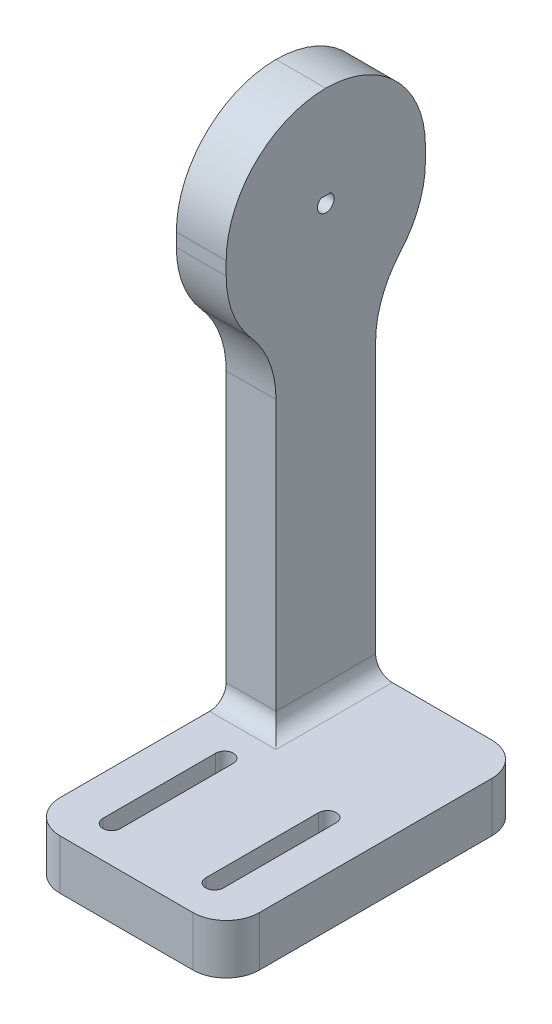
ISO-10303-21;
HEADER;
FILE_DESCRIPTION(('STEP AP214'),'2;1');
FILE_NAME('part.step','',(''),(''),'','','');
FILE_SCHEMA(('AUTOMOTIVE_DESIGN { 1 0 10303 214 1 1 1 1 }'));
ENDSEC;
DATA;
#1=APPLICATION_CONTEXT('core data for automotive mechanical design processes');
#2=APPLICATION_PROTOCOL_DEFINITION('international standard','automotive_design',2000,#1);
#3=PRODUCT_CONTEXT('',#1,'mechanical');
#4=PRODUCT('Part','Part','',(#3));
#5=PRODUCT_RELATED_PRODUCT_CATEGORY('part','',(#4));
#6=PRODUCT_DEFINITION_FORMATION('','',#4);
#7=PRODUCT_DEFINITION_CONTEXT('part definition',#1,'design');
#8=PRODUCT_DEFINITION('design','',#6,#7);
#9=PRODUCT_DEFINITION_SHAPE('','',#8);
#10=(LENGTH_UNIT() NAMED_UNIT(*) SI_UNIT(.MILLI.,.METRE.));
#11=(NAMED_UNIT(*) PLANE_ANGLE_UNIT() SI_UNIT($,.RADIAN.));
#12=(NAMED_UNIT(*) SI_UNIT($,.STERADIAN.) SOLID_ANGLE_UNIT());
#13=UNCERTAINTY_MEASURE_WITH_UNIT(LENGTH_MEASURE(1.E-05),#10,'distance_accuracy_value','');
#14=(GEOMETRIC_REPRESENTATION_CONTEXT(3) GLOBAL_UNCERTAINTY_ASSIGNED_CONTEXT((#13)) GLOBAL_UNIT_ASSIGNED_CONTEXT((#10,
#11,#12)) REPRESENTATION_CONTEXT('',''));
#15=CARTESIAN_POINT('',(0.,0.,0.));
#16=DIRECTION('',(0.,0.,1.));
#17=DIRECTION('',(1.,0.,0.));
#18=AXIS2_PLACEMENT_3D('',#15,#16,#17);
#19=CARTESIAN_POINT('',(15.,-30.,30.));
#20=DIRECTION('',(0.,0.,-1.));
#21=DIRECTION('',(-1.,0.,0.));
#22=AXIS2_PLACEMENT_3D('',#19,#20,#21);
#23=PLANE('',#22);
#24=DIRECTION('',(0.,-1.,0.));
#25=VECTOR('',#24,1.);
#26=CARTESIAN_POINT('',(15.,-30.,30.));
#27=LINE('',#26,#25);
#28=CARTESIAN_POINT('',(15.,0.,30.));
#29=VERTEX_POINT('',#28);
#30=CARTESIAN_POINT('',(15.,-4.01923788646685,30.));
#31=VERTEX_POINT('',#30);
#32=EDGE_CURVE('E335',#29,#31,#27,.T.);
#33=ORIENTED_EDGE('',*,*,#32,.F.);
#34=DIRECTION('',(-1.,0.,0.));
#35=VECTOR('',#34,1.);
#36=CARTESIAN_POINT('',(15.,0.,30.));
#37=LINE('',#36,#35);
#38=CARTESIAN_POINT('',(0.,0.,30.));
#39=VERTEX_POINT('',#38);
#40=EDGE_CURVE('E348',#29,#39,#37,.T.);
#41=ORIENTED_EDGE('',*,*,#40,.T.);
#42=DIRECTION('',(0.,-1.,0.));
#43=VECTOR('',#42,1.);
#44=CARTESIAN_POINT('',(0.,-30.,30.));
#45=LINE('',#44,#43);
#46=CARTESIAN_POINT('',(0.,-4.01923788646685,30.));
#47=VERTEX_POINT('',#46);
#48=EDGE_CURVE('E334',#39,#47,#45,.T.);
#49=ORIENTED_EDGE('',*,*,#48,.T.);
#50=DIRECTION('',(-1.,0.,0.));
#51=VECTOR('',#50,1.);
#52=CARTESIAN_POINT('',(15.,-4.01923788646685,30.));
#53=LINE('',#52,#51);
#54=EDGE_CURVE('E342',#47,#31,#53,.F.);
#55=ORIENTED_EDGE('',*,*,#54,.T.);
#56=EDGE_LOOP('',(#33,#41,#49,#55));
#57=FACE_BOUND('',#56,.T.);
#58=ADVANCED_FACE('F33',(#57),#23,.F.);
#59=CARTESIAN_POINT('',(15.,-30.,-30.));
#60=DIRECTION('',(0.,0.,1.));
#61=DIRECTION('',(0.,-1.,0.));
#62=AXIS2_PLACEMENT_3D('',#59,#60,#61);
#63=PLANE('',#62);
#64=DIRECTION('',(0.,1.,0.));
#65=VECTOR('',#64,1.);
#66=CARTESIAN_POINT('',(15.,-30.,-30.));
#67=LINE('',#66,#65);
#68=CARTESIAN_POINT('',(15.,-4.01923788646684,-30.));
#69=VERTEX_POINT('',#68);
#70=CARTESIAN_POINT('',(15.,0.,-30.));
#71=VERTEX_POINT('',#70);
#72=EDGE_CURVE('E338',#69,#71,#67,.T.);
#73=ORIENTED_EDGE('',*,*,#72,.F.);
#74=DIRECTION('',(1.,0.,0.));
#75=VECTOR('',#74,1.);
#76=CARTESIAN_POINT('',(15.,-4.01923788646684,-30.));
#77=LINE('',#76,#75);
#78=CARTESIAN_POINT('',(0.,-4.01923788646684,-30.));
#79=VERTEX_POINT('',#78);
#80=EDGE_CURVE('E370',#69,#79,#77,.F.);
#81=ORIENTED_EDGE('',*,*,#80,.T.);
#82=DIRECTION('',(0.,1.,0.));
#83=VECTOR('',#82,1.);
#84=CARTESIAN_POINT('',(0.,-30.,-30.));
#85=LINE('',#84,#83);
#86=CARTESIAN_POINT('',(0.,0.,-30.));
#87=VERTEX_POINT('',#86);
#88=EDGE_CURVE('E339',#79,#87,#85,.T.);
#89=ORIENTED_EDGE('',*,*,#88,.T.);
#90=DIRECTION('',(-1.,0.,0.));
#91=VECTOR('',#90,1.);
#92=CARTESIAN_POINT('',(15.,0.,-30.));
#93=LINE('',#92,#91);
#94=EDGE_CURVE('E368',#87,#71,#93,.F.);
#95=ORIENTED_EDGE('',*,*,#94,.T.);
#96=EDGE_LOOP('',(#73,#81,#89,#95));
#97=FACE_BOUND('',#96,.T.);
#98=ADVANCED_FACE('F467',(#97),#63,.F.);
#99=CARTESIAN_POINT('',(15.,0.,0.));
#100=DIRECTION('',(1.,0.,0.));
#101=DIRECTION('',(0.,0.,-1.));
#102=AXIS2_PLACEMENT_3D('',#99,#100,#101);
#103=PLANE('',#102);
#104=DIRECTION('',(0.,0.,1.));
#105=VECTOR('',#104,1.);
#106=CARTESIAN_POINT('',(15.,2.,0.));
#107=LINE('',#106,#105);
#108=CARTESIAN_POINT('',(15.,2.,-1.5));
#109=VERTEX_POINT('',#108);
#110=CARTESIAN_POINT('',(15.,2.,1.5));
#111=VERTEX_POINT('',#110);
#112=EDGE_CURVE('E319',#109,#111,#107,.T.);
#113=ORIENTED_EDGE('',*,*,#112,.F.);
#114=CARTESIAN_POINT('',(15.,0.,0.));
#115=DIRECTION('',(1.,0.,0.));
#116=DIRECTION('',(0.,0.,-1.));
#117=AXIS2_PLACEMENT_3D('',#114,#115,#116);
#118=CIRCLE('',#117,2.5);
#119=EDGE_CURVE('E326',#111,#109,#118,.T.);
#120=ORIENTED_EDGE('',*,*,#119,.F.);
#121=EDGE_LOOP('',(#113,#120));
#122=FACE_BOUND('',#121,.T.);
#123=DIRECTION('',(0.,1.,0.));
#124=VECTOR('',#123,1.);
#125=CARTESIAN_POINT('',(15.,-130.,15.));
#126=LINE('',#125,#124);
#127=CARTESIAN_POINT('',(15.,-125.,15.));
#128=VERTEX_POINT('',#127);
#129=CARTESIAN_POINT('',(15.,-43.7055075524357,15.));
#130=VERTEX_POINT('',#129);
#131=EDGE_CURVE('E311',#128,#130,#126,.T.);
#132=ORIENTED_EDGE('',*,*,#131,.F.);
#133=DIRECTION('',(0.,0.,1.));
#134=VECTOR('',#133,1.);
#135=CARTESIAN_POINT('',(15.,-125.,-15.));
#136=LINE('',#135,#134);
#137=CARTESIAN_POINT('',(15.,-125.,-15.));
#138=VERTEX_POINT('',#137);
#139=EDGE_CURVE('E384',#128,#138,#136,.F.);
#140=ORIENTED_EDGE('',*,*,#139,.T.);
#141=DIRECTION('',(0.,1.,0.));
#142=VECTOR('',#141,1.);
#143=CARTESIAN_POINT('',(15.,-130.,-15.));
#144=LINE('',#143,#142);
#145=CARTESIAN_POINT('',(15.,-43.7055075524357,-15.));
#146=VERTEX_POINT('',#145);
#147=EDGE_CURVE('E314',#138,#146,#144,.T.);
#148=ORIENTED_EDGE('',*,*,#147,.T.);
#149=CARTESIAN_POINT('',(15.,-43.7055075524357,-45.));
#150=DIRECTION('',(1.,0.,0.));
#151=DIRECTION('',(0.,0.,-1.));
#152=AXIS2_PLACEMENT_3D('',#149,#150,#151);
#153=CIRCLE('',#152,30.);
#154=CARTESIAN_POINT('',(15.,-23.8623727194513,-22.5));
#155=VERTEX_POINT('',#154);
#156=EDGE_CURVE('E41',#146,#155,#153,.F.);
#157=ORIENTED_EDGE('',*,*,#156,.T.);
#158=CARTESIAN_POINT('',(15.,-4.01923788646684,0.));
#159=DIRECTION('',(1.,0.,0.));
#160=DIRECTION('',(0.,0.,-1.));
#161=AXIS2_PLACEMENT_3D('',#158,#159,#160);
#162=CIRCLE('',#161,30.);
#163=EDGE_CURVE('E363',#155,#69,#162,.T.);
#164=ORIENTED_EDGE('',*,*,#163,.T.);
#165=ORIENTED_EDGE('',*,*,#72,.T.);
#166=CARTESIAN_POINT('',(15.,0.,0.));
#167=DIRECTION('',(1.,0.,0.));
#168=DIRECTION('',(0.,0.,-1.));
#169=AXIS2_PLACEMENT_3D('',#166,#167,#168);
#170=CIRCLE('',#169,30.);
#171=CARTESIAN_POINT('',(15.,30.,0.));
#172=VERTEX_POINT('',#171);
#173=EDGE_CURVE('E359',#71,#172,#170,.T.);
#174=ORIENTED_EDGE('',*,*,#173,.T.);
#175=CARTESIAN_POINT('',(15.,0.,0.));
#176=DIRECTION('',(1.,0.,0.));
#177=DIRECTION('',(0.,0.,-1.));
#178=AXIS2_PLACEMENT_3D('',#175,#176,#177);
#179=CIRCLE('',#178,30.);
#180=EDGE_CURVE('E361',#172,#29,#179,.T.);
#181=ORIENTED_EDGE('',*,*,#180,.T.);
#182=ORIENTED_EDGE('',*,*,#32,.T.);
#183=CARTESIAN_POINT('',(15.,-4.01923788646685,0.));
#184=DIRECTION('',(1.,0.,0.));
#185=DIRECTION('',(0.,0.,-1.));
#186=AXIS2_PLACEMENT_3D('',#183,#184,#185);
#187=CIRCLE('',#186,30.);
#188=CARTESIAN_POINT('',(15.,-23.8623727194513,22.5));
#189=VERTEX_POINT('',#188);
#190=EDGE_CURVE('E365',#31,#189,#187,.T.);
#191=ORIENTED_EDGE('',*,*,#190,.T.);
#192=CARTESIAN_POINT('',(15.,-43.7055075524357,45.));
#193=DIRECTION('',(1.,0.,0.));
#194=DIRECTION('',(0.,0.,-1.));
#195=AXIS2_PLACEMENT_3D('',#192,#193,#194);
#196=CIRCLE('',#195,30.);
#197=EDGE_CURVE('E430',#189,#130,#196,.F.);
#198=ORIENTED_EDGE('',*,*,#197,.T.);
#199=EDGE_LOOP('',(#132,#140,#148,#157,#164,#165,#174,#181,#182,#191,#198));
#200=FACE_BOUND('',#199,.T.);
#201=ADVANCED_FACE('F433',(#122,#200),#103,.T.);
#202=CARTESIAN_POINT('',(0.,0.,0.));
#203=DIRECTION('',(1.,0.,0.));
#204=DIRECTION('',(0.,0.,-1.));
#205=AXIS2_PLACEMENT_3D('',#202,#203,#204);
#206=PLANE('',#205);
#207=CARTESIAN_POINT('',(0.,0.,0.));
#208=DIRECTION('',(1.,0.,0.));
#209=DIRECTION('',(0.,0.,-1.));
#210=AXIS2_PLACEMENT_3D('',#207,#208,#209);
#211=CIRCLE('',#210,2.5);
#212=CARTESIAN_POINT('',(0.,2.,-1.5));
#213=VERTEX_POINT('',#212);
#214=CARTESIAN_POINT('',(0.,2.,1.5));
#215=VERTEX_POINT('',#214);
#216=EDGE_CURVE('E323',#213,#215,#211,.F.);
#217=ORIENTED_EDGE('',*,*,#216,.F.);
#218=DIRECTION('',(0.,0.,-1.));
#219=VECTOR('',#218,1.);
#220=CARTESIAN_POINT('',(0.,2.,0.));
#221=LINE('',#220,#219);
#222=EDGE_CURVE('E320',#215,#213,#221,.T.);
#223=ORIENTED_EDGE('',*,*,#222,.F.);
#224=EDGE_LOOP('',(#217,#223));
#225=FACE_BOUND('',#224,.T.);
#226=DIRECTION('',(0.,0.,-1.));
#227=VECTOR('',#226,1.);
#228=CARTESIAN_POINT('',(0.,-145.,-15.));
#229=LINE('',#228,#227);
#230=CARTESIAN_POINT('',(0.,-145.,65.));
#231=VERTEX_POINT('',#230);
#232=CARTESIAN_POINT('',(0.,-145.,-15.));
#233=VERTEX_POINT('',#232);
#234=EDGE_CURVE('E287',#231,#233,#229,.T.);
#235=ORIENTED_EDGE('',*,*,#234,.F.);
#236=DIRECTION('',(0.,1.,0.));
#237=VECTOR('',#236,1.);
#238=CARTESIAN_POINT('',(0.,0.,65.));
#239=LINE('',#238,#237);
#240=CARTESIAN_POINT('',(0.,-130.,65.));
#241=VERTEX_POINT('',#240);
#242=EDGE_CURVE('E414',#231,#241,#239,.T.);
#243=ORIENTED_EDGE('',*,*,#242,.T.);
#244=DIRECTION('',(0.,0.,-1.));
#245=VECTOR('',#244,1.);
#246=CARTESIAN_POINT('',(0.,-130.,0.));
#247=LINE('',#246,#245);
#248=CARTESIAN_POINT('',(0.,-130.,20.));
#249=VERTEX_POINT('',#248);
#250=EDGE_CURVE('E290',#241,#249,#247,.T.);
#251=ORIENTED_EDGE('',*,*,#250,.T.);
#252=CARTESIAN_POINT('',(0.,-125.,20.));
#253=DIRECTION('',(1.,0.,0.));
#254=DIRECTION('',(0.,0.,-1.));
#255=AXIS2_PLACEMENT_3D('',#252,#253,#254);
#256=CIRCLE('',#255,5.);
#257=CARTESIAN_POINT('',(0.,-125.,15.));
#258=VERTEX_POINT('',#257);
#259=EDGE_CURVE('E386',#249,#258,#256,.T.);
#260=ORIENTED_EDGE('',*,*,#259,.T.);
#261=DIRECTION('',(0.,1.,0.));
#262=VECTOR('',#261,1.);
#263=CARTESIAN_POINT('',(0.,-130.,15.));
#264=LINE('',#263,#262);
#265=CARTESIAN_POINT('',(0.,-43.7055075524357,15.));
#266=VERTEX_POINT('',#265);
#267=EDGE_CURVE('E299',#258,#266,#264,.T.);
#268=ORIENTED_EDGE('',*,*,#267,.T.);
#269=CARTESIAN_POINT('',(0.,-43.7055075524357,45.));
#270=DIRECTION('',(1.,0.,0.));
#271=DIRECTION('',(0.,0.,-1.));
#272=AXIS2_PLACEMENT_3D('',#269,#270,#271);
#273=CIRCLE('',#272,30.);
#274=CARTESIAN_POINT('',(0.,-23.8623727194513,22.5));
#275=VERTEX_POINT('',#274);
#276=EDGE_CURVE('E428',#266,#275,#273,.T.);
#277=ORIENTED_EDGE('',*,*,#276,.T.);
#278=CARTESIAN_POINT('',(0.,-4.01923788646685,0.));
#279=DIRECTION('',(1.,0.,0.));
#280=DIRECTION('',(0.,0.,-1.));
#281=AXIS2_PLACEMENT_3D('',#278,#279,#280);
#282=CIRCLE('',#281,30.);
#283=EDGE_CURVE('E357',#275,#47,#282,.F.);
#284=ORIENTED_EDGE('',*,*,#283,.T.);
#285=ORIENTED_EDGE('',*,*,#48,.F.);
#286=CARTESIAN_POINT('',(0.,0.,0.));
#287=DIRECTION('',(1.,0.,0.));
#288=DIRECTION('',(0.,0.,-1.));
#289=AXIS2_PLACEMENT_3D('',#286,#287,#288);
#290=CIRCLE('',#289,30.);
#291=CARTESIAN_POINT('',(0.,30.,0.));
#292=VERTEX_POINT('',#291);
#293=EDGE_CURVE('E353',#39,#292,#290,.F.);
#294=ORIENTED_EDGE('',*,*,#293,.T.);
#295=CARTESIAN_POINT('',(0.,0.,0.));
#296=DIRECTION('',(1.,0.,0.));
#297=DIRECTION('',(0.,0.,-1.));
#298=AXIS2_PLACEMENT_3D('',#295,#296,#297);
#299=CIRCLE('',#298,30.);
#300=EDGE_CURVE('E351',#292,#87,#299,.F.);
#301=ORIENTED_EDGE('',*,*,#300,.T.);
#302=ORIENTED_EDGE('',*,*,#88,.F.);
#303=CARTESIAN_POINT('',(0.,-4.01923788646684,0.));
#304=DIRECTION('',(1.,0.,0.));
#305=DIRECTION('',(0.,0.,-1.));
#306=AXIS2_PLACEMENT_3D('',#303,#304,#305);
#307=CIRCLE('',#306,30.);
#308=CARTESIAN_POINT('',(0.,-23.8623727194513,-22.5));
#309=VERTEX_POINT('',#308);
#310=EDGE_CURVE('E355',#79,#309,#307,.F.);
#311=ORIENTED_EDGE('',*,*,#310,.T.);
#312=CARTESIAN_POINT('',(0.,-43.7055075524357,-45.));
#313=DIRECTION('',(1.,0.,0.));
#314=DIRECTION('',(0.,0.,-1.));
#315=AXIS2_PLACEMENT_3D('',#312,#313,#314);
#316=CIRCLE('',#315,30.);
#317=CARTESIAN_POINT('',(0.,-43.7055075524357,-15.));
#318=VERTEX_POINT('',#317);
#319=EDGE_CURVE('E11',#309,#318,#316,.T.);
#320=ORIENTED_EDGE('',*,*,#319,.T.);
#321=DIRECTION('',(0.,1.,0.));
#322=VECTOR('',#321,1.);
#323=CARTESIAN_POINT('',(0.,-130.,-15.));
#324=LINE('',#323,#322);
#325=EDGE_CURVE('E316',#233,#318,#324,.T.);
#326=ORIENTED_EDGE('',*,*,#325,.F.);
#327=EDGE_LOOP('',(#235,#243,#251,#260,#268,#277,#284,#285,#294,#301,#302,#311,#320,#326));
#328=FACE_BOUND('',#327,.T.);
#329=ADVANCED_FACE('F447',(#225,#328),#206,.F.);
#330=CARTESIAN_POINT('',(-6.72681202353685,2.,0.));
#331=DIRECTION('',(0.,1.,0.));
#332=DIRECTION('',(0.,0.,1.));
#333=AXIS2_PLACEMENT_3D('',#330,#331,#332);
#334=PLANE('',#333);
#335=ORIENTED_EDGE('',*,*,#222,.T.);
#336=DIRECTION('',(1.,0.,0.));
#337=VECTOR('',#336,1.);
#338=CARTESIAN_POINT('',(-6.72681202353685,2.,-1.5));
#339=LINE('',#338,#337);
#340=EDGE_CURVE('E324',#213,#109,#339,.T.);
#341=ORIENTED_EDGE('',*,*,#340,.T.);
#342=ORIENTED_EDGE('',*,*,#112,.T.);
#343=DIRECTION('',(1.,0.,0.));
#344=VECTOR('',#343,1.);
#345=CARTESIAN_POINT('',(-6.72681202353685,2.,1.5));
#346=LINE('',#345,#344);
#347=EDGE_CURVE('E329',#215,#111,#346,.T.);
#348=ORIENTED_EDGE('',*,*,#347,.F.);
#349=EDGE_LOOP('',(#335,#341,#342,#348));
#350=FACE_BOUND('',#349,.T.);
#351=ADVANCED_FACE('F701',(#350),#334,.F.);
#352=CARTESIAN_POINT('',(-6.72681202353685,0.,0.));
#353=DIRECTION('',(1.,0.,0.));
#354=DIRECTION('',(0.,0.,-1.));
#355=AXIS2_PLACEMENT_3D('',#352,#353,#354);
#356=CYLINDRICAL_SURFACE('',#355,2.5);
#357=ORIENTED_EDGE('',*,*,#216,.T.);
#358=ORIENTED_EDGE('',*,*,#347,.T.);
#359=ORIENTED_EDGE('',*,*,#119,.T.);
#360=ORIENTED_EDGE('',*,*,#340,.F.);
#361=EDGE_LOOP('',(#357,#358,#359,#360));
#362=FACE_BOUND('',#361,.T.);
#363=ADVANCED_FACE('F705',(#362),#356,.F.);
#364=CARTESIAN_POINT('',(0.,-130.,-15.));
#365=DIRECTION('',(0.,0.,1.));
#366=DIRECTION('',(0.,-1.,0.));
#367=AXIS2_PLACEMENT_3D('',#364,#365,#366);
#368=PLANE('',#367);
#369=ORIENTED_EDGE('',*,*,#325,.T.);
#370=DIRECTION('',(1.,0.,0.));
#371=VECTOR('',#370,1.);
#372=CARTESIAN_POINT('',(0.,-43.7055075524357,-15.));
#373=LINE('',#372,#371);
#374=EDGE_CURVE('E424',#318,#146,#373,.T.);
#375=ORIENTED_EDGE('',*,*,#374,.T.);
#376=ORIENTED_EDGE('',*,*,#147,.F.);
#377=CARTESIAN_POINT('',(20.,-125.,-15.));
#378=DIRECTION('',(0.,0.,1.));
#379=DIRECTION('',(0.,-1.,0.));
#380=AXIS2_PLACEMENT_3D('',#377,#378,#379);
#381=CIRCLE('',#380,5.);
#382=CARTESIAN_POINT('',(20.,-130.,-15.));
#383=VERTEX_POINT('',#382);
#384=EDGE_CURVE('E388',#138,#383,#381,.T.);
#385=ORIENTED_EDGE('',*,*,#384,.T.);
#386=DIRECTION('',(1.,0.,0.));
#387=VECTOR('',#386,1.);
#388=CARTESIAN_POINT('',(60.,-130.,-15.));
#389=LINE('',#388,#387);
#390=CARTESIAN_POINT('',(50.,-130.,-15.));
#391=VERTEX_POINT('',#390);
#392=EDGE_CURVE('E286',#383,#391,#389,.T.);
#393=ORIENTED_EDGE('',*,*,#392,.T.);
#394=DIRECTION('',(0.,1.,0.));
#395=VECTOR('',#394,1.);
#396=CARTESIAN_POINT('',(50.,-130.,-15.));
#397=LINE('',#396,#395);
#398=CARTESIAN_POINT('',(50.,-145.,-15.));
#399=VERTEX_POINT('',#398);
#400=EDGE_CURVE('E417',#391,#399,#397,.F.);
#401=ORIENTED_EDGE('',*,*,#400,.T.);
#402=DIRECTION('',(1.,0.,0.));
#403=VECTOR('',#402,1.);
#404=CARTESIAN_POINT('',(60.,-145.,-15.));
#405=LINE('',#404,#403);
#406=EDGE_CURVE('E289',#233,#399,#405,.T.);
#407=ORIENTED_EDGE('',*,*,#406,.F.);
#408=EDGE_LOOP('',(#369,#375,#376,#385,#393,#401,#407));
#409=FACE_BOUND('',#408,.T.);
#410=ADVANCED_FACE('F476',(#409),#368,.F.);
#411=CARTESIAN_POINT('',(0.,-130.,15.));
#412=DIRECTION('',(0.,0.,-1.));
#413=DIRECTION('',(0.,1.,0.));
#414=AXIS2_PLACEMENT_3D('',#411,#412,#413);
#415=PLANE('',#414);
#416=ORIENTED_EDGE('',*,*,#131,.T.);
#417=DIRECTION('',(-1.,0.,0.));
#418=VECTOR('',#417,1.);
#419=CARTESIAN_POINT('',(0.,-43.7055075524357,15.));
#420=LINE('',#419,#418);
#421=EDGE_CURVE('E419',#130,#266,#420,.T.);
#422=ORIENTED_EDGE('',*,*,#421,.T.);
#423=ORIENTED_EDGE('',*,*,#267,.F.);
#424=DIRECTION('',(-1.,0.,0.));
#425=VECTOR('',#424,1.);
#426=CARTESIAN_POINT('',(0.,-125.,15.));
#427=LINE('',#426,#425);
#428=EDGE_CURVE('E382',#258,#128,#427,.F.);
#429=ORIENTED_EDGE('',*,*,#428,.T.);
#430=EDGE_LOOP('',(#416,#422,#423,#429));
#431=FACE_BOUND('',#430,.T.);
#432=ADVANCED_FACE('F440',(#431),#415,.F.);
#433=CARTESIAN_POINT('',(60.,-145.,75.));
#434=DIRECTION('',(-1.,0.,0.));
#435=DIRECTION('',(0.,0.,1.));
#436=AXIS2_PLACEMENT_3D('',#433,#434,#435);
#437=PLANE('',#436);
#438=DIRECTION('',(0.,0.,1.));
#439=VECTOR('',#438,1.);
#440=CARTESIAN_POINT('',(60.,-130.,75.));
#441=LINE('',#440,#439);
#442=CARTESIAN_POINT('',(60.,-130.,-4.99999999999999));
#443=VERTEX_POINT('',#442);
#444=CARTESIAN_POINT('',(60.,-130.,65.));
#445=VERTEX_POINT('',#444);
#446=EDGE_CURVE('E302',#443,#445,#441,.T.);
#447=ORIENTED_EDGE('',*,*,#446,.T.);
#448=DIRECTION('',(0.,1.,0.));
#449=VECTOR('',#448,1.);
#450=CARTESIAN_POINT('',(60.,-145.,65.));
#451=LINE('',#450,#449);
#452=CARTESIAN_POINT('',(60.,-145.,65.));
#453=VERTEX_POINT('',#452);
#454=EDGE_CURVE('E406',#445,#453,#451,.F.);
#455=ORIENTED_EDGE('',*,*,#454,.T.);
#456=DIRECTION('',(0.,0.,1.));
#457=VECTOR('',#456,1.);
#458=CARTESIAN_POINT('',(60.,-145.,75.));
#459=LINE('',#458,#457);
#460=CARTESIAN_POINT('',(60.,-145.,-4.99999999999999));
#461=VERTEX_POINT('',#460);
#462=EDGE_CURVE('E293',#461,#453,#459,.T.);
#463=ORIENTED_EDGE('',*,*,#462,.F.);
#464=DIRECTION('',(0.,1.,0.));
#465=VECTOR('',#464,1.);
#466=CARTESIAN_POINT('',(60.,-145.,-5.00000000000002));
#467=LINE('',#466,#465);
#468=EDGE_CURVE('E403',#461,#443,#467,.T.);
#469=ORIENTED_EDGE('',*,*,#468,.T.);
#470=EDGE_LOOP('',(#447,#455,#463,#469));
#471=FACE_BOUND('',#470,.T.);
#472=ADVANCED_FACE('F488',(#471),#437,.F.);
#473=CARTESIAN_POINT('',(0.,-145.,75.));
#474=DIRECTION('',(0.,0.,-1.));
#475=DIRECTION('',(0.,1.,0.));
#476=AXIS2_PLACEMENT_3D('',#473,#474,#475);
#477=PLANE('',#476);
#478=DIRECTION('',(-1.,0.,0.));
#479=VECTOR('',#478,1.);
#480=CARTESIAN_POINT('',(0.,-145.,75.));
#481=LINE('',#480,#479);
#482=CARTESIAN_POINT('',(50.,-145.,75.));
#483=VERTEX_POINT('',#482);
#484=CARTESIAN_POINT('',(10.,-145.,75.));
#485=VERTEX_POINT('',#484);
#486=EDGE_CURVE('E296',#483,#485,#481,.T.);
#487=ORIENTED_EDGE('',*,*,#486,.F.);
#488=DIRECTION('',(0.,1.,0.));
#489=VECTOR('',#488,1.);
#490=CARTESIAN_POINT('',(50.,-145.,75.));
#491=LINE('',#490,#489);
#492=CARTESIAN_POINT('',(50.,-130.,75.));
#493=VERTEX_POINT('',#492);
#494=EDGE_CURVE('E394',#483,#493,#491,.T.);
#495=ORIENTED_EDGE('',*,*,#494,.T.);
#496=DIRECTION('',(-1.,0.,0.));
#497=VECTOR('',#496,1.);
#498=CARTESIAN_POINT('',(0.,-130.,75.));
#499=LINE('',#498,#497);
#500=CARTESIAN_POINT('',(10.,-130.,75.));
#501=VERTEX_POINT('',#500);
#502=EDGE_CURVE('E305',#493,#501,#499,.T.);
#503=ORIENTED_EDGE('',*,*,#502,.T.);
#504=DIRECTION('',(0.,1.,0.));
#505=VECTOR('',#504,1.);
#506=CARTESIAN_POINT('',(10.,-145.,75.));
#507=LINE('',#506,#505);
#508=EDGE_CURVE('E390',#501,#485,#507,.F.);
#509=ORIENTED_EDGE('',*,*,#508,.T.);
#510=EDGE_LOOP('',(#487,#495,#503,#509));
#511=FACE_BOUND('',#510,.T.);
#512=ADVANCED_FACE('F499',(#511),#477,.F.);
#513=CARTESIAN_POINT('',(0.,-145.,0.));
#514=DIRECTION('',(0.,1.,0.));
#515=DIRECTION('',(0.,0.,1.));
#516=AXIS2_PLACEMENT_3D('',#513,#514,#515);
#517=PLANE('',#516);
#518=DIRECTION('',(0.,0.,1.));
#519=VECTOR('',#518,1.);
#520=CARTESIAN_POINT('',(17.15,-145.,64.));
#521=LINE('',#520,#519);
#522=CARTESIAN_POINT('',(17.15,-145.,30.));
#523=VERTEX_POINT('',#522);
#524=CARTESIAN_POINT('',(17.15,-145.,64.));
#525=VERTEX_POINT('',#524);
#526=EDGE_CURVE('E794',#523,#525,#521,.T.);
#527=ORIENTED_EDGE('',*,*,#526,.F.);
#528=CARTESIAN_POINT('',(14.5,-145.,30.));
#529=DIRECTION('',(0.,1.,0.));
#530=DIRECTION('',(0.,0.,1.));
#531=AXIS2_PLACEMENT_3D('',#528,#529,#530);
#532=CIRCLE('',#531,2.65);
#533=CARTESIAN_POINT('',(11.85,-145.,30.));
#534=VERTEX_POINT('',#533);
#535=EDGE_CURVE('E257',#534,#523,#532,.F.);
#536=ORIENTED_EDGE('',*,*,#535,.F.);
#537=DIRECTION('',(0.,0.,-1.));
#538=VECTOR('',#537,1.);
#539=CARTESIAN_POINT('',(11.85,-145.,64.));
#540=LINE('',#539,#538);
#541=CARTESIAN_POINT('',(11.85,-145.,64.));
#542=VERTEX_POINT('',#541);
#543=EDGE_CURVE('E254',#542,#534,#540,.T.);
#544=ORIENTED_EDGE('',*,*,#543,.F.);
#545=CARTESIAN_POINT('',(14.5,-145.,64.));
#546=DIRECTION('',(0.,1.,0.));
#547=DIRECTION('',(0.,0.,1.));
#548=AXIS2_PLACEMENT_3D('',#545,#546,#547);
#549=CIRCLE('',#548,2.65);
#550=EDGE_CURVE('E227',#525,#542,#549,.F.);
#551=ORIENTED_EDGE('',*,*,#550,.F.);
#552=EDGE_LOOP('',(#527,#536,#544,#551));
#553=FACE_BOUND('',#552,.T.);
#554=DIRECTION('',(0.,0.,-1.));
#555=VECTOR('',#554,1.);
#556=CARTESIAN_POINT('',(42.85,-145.,64.));
#557=LINE('',#556,#555);
#558=CARTESIAN_POINT('',(42.85,-145.,64.));
#559=VERTEX_POINT('',#558);
#560=CARTESIAN_POINT('',(42.85,-145.,30.));
#561=VERTEX_POINT('',#560);
#562=EDGE_CURVE('E261',#559,#561,#557,.T.);
#563=ORIENTED_EDGE('',*,*,#562,.F.);
#564=CARTESIAN_POINT('',(45.5,-145.,64.));
#565=DIRECTION('',(0.,1.,0.));
#566=DIRECTION('',(0.,0.,1.));
#567=AXIS2_PLACEMENT_3D('',#564,#565,#566);
#568=CIRCLE('',#567,2.65);
#569=CARTESIAN_POINT('',(48.15,-145.,64.));
#570=VERTEX_POINT('',#569);
#571=EDGE_CURVE('E264',#570,#559,#568,.F.);
#572=ORIENTED_EDGE('',*,*,#571,.F.);
#573=DIRECTION('',(0.,0.,1.));
#574=VECTOR('',#573,1.);
#575=CARTESIAN_POINT('',(48.15,-145.,64.));
#576=LINE('',#575,#574);
#577=CARTESIAN_POINT('',(48.15,-145.,30.));
#578=VERTEX_POINT('',#577);
#579=EDGE_CURVE('E266',#578,#570,#576,.T.);
#580=ORIENTED_EDGE('',*,*,#579,.F.);
#581=CARTESIAN_POINT('',(45.5,-145.,30.));
#582=DIRECTION('',(0.,1.,0.));
#583=DIRECTION('',(0.,0.,1.));
#584=AXIS2_PLACEMENT_3D('',#581,#582,#583);
#585=CIRCLE('',#584,2.65);
#586=EDGE_CURVE('E258',#561,#578,#585,.F.);
#587=ORIENTED_EDGE('',*,*,#586,.F.);
#588=EDGE_LOOP('',(#563,#572,#580,#587));
#589=FACE_BOUND('',#588,.T.);
#590=ORIENTED_EDGE('',*,*,#462,.T.);
#591=CARTESIAN_POINT('',(50.,-145.,65.));
#592=DIRECTION('',(0.,1.,0.));
#593=DIRECTION('',(0.,0.,1.));
#594=AXIS2_PLACEMENT_3D('',#591,#592,#593);
#595=CIRCLE('',#594,10.);
#596=EDGE_CURVE('E412',#453,#483,#595,.F.);
#597=ORIENTED_EDGE('',*,*,#596,.T.);
#598=ORIENTED_EDGE('',*,*,#486,.T.);
#599=CARTESIAN_POINT('',(10.,-145.,65.));
#600=DIRECTION('',(0.,1.,0.));
#601=DIRECTION('',(0.,0.,1.));
#602=AXIS2_PLACEMENT_3D('',#599,#600,#601);
#603=CIRCLE('',#602,10.);
#604=EDGE_CURVE('E410',#485,#231,#603,.F.);
#605=ORIENTED_EDGE('',*,*,#604,.T.);
#606=ORIENTED_EDGE('',*,*,#234,.T.);
#607=ORIENTED_EDGE('',*,*,#406,.T.);
#608=CARTESIAN_POINT('',(50.,-145.,-5.00000000000002));
#609=DIRECTION('',(0.,1.,0.));
#610=DIRECTION('',(0.,0.,1.));
#611=AXIS2_PLACEMENT_3D('',#608,#609,#610);
#612=CIRCLE('',#611,10.);
#613=EDGE_CURVE('E408',#399,#461,#612,.F.);
#614=ORIENTED_EDGE('',*,*,#613,.T.);
#615=EDGE_LOOP('',(#590,#597,#598,#605,#606,#607,#614));
#616=FACE_BOUND('',#615,.T.);
#617=ADVANCED_FACE('F481',(#553,#589,#616),#517,.F.);
#618=CARTESIAN_POINT('',(0.,-130.,0.));
#619=DIRECTION('',(0.,1.,0.));
#620=DIRECTION('',(0.,0.,1.));
#621=AXIS2_PLACEMENT_3D('',#618,#619,#620);
#622=PLANE('',#621);
#623=CARTESIAN_POINT('',(14.5,-130.,30.));
#624=DIRECTION('',(0.,1.,0.));
#625=DIRECTION('',(0.,0.,1.));
#626=AXIS2_PLACEMENT_3D('',#623,#624,#625);
#627=CIRCLE('',#626,2.65);
#628=CARTESIAN_POINT('',(17.15,-130.,30.));
#629=VERTEX_POINT('',#628);
#630=CARTESIAN_POINT('',(11.85,-130.,30.));
#631=VERTEX_POINT('',#630);
#632=EDGE_CURVE('E240',#629,#631,#627,.T.);
#633=ORIENTED_EDGE('',*,*,#632,.F.);
#634=DIRECTION('',(0.,0.,-1.));
#635=VECTOR('',#634,1.);
#636=CARTESIAN_POINT('',(17.15,-130.,64.));
#637=LINE('',#636,#635);
#638=CARTESIAN_POINT('',(17.15,-130.,64.));
#639=VERTEX_POINT('',#638);
#640=EDGE_CURVE('E245',#639,#629,#637,.T.);
#641=ORIENTED_EDGE('',*,*,#640,.F.);
#642=CARTESIAN_POINT('',(14.5,-130.,64.));
#643=DIRECTION('',(0.,1.,0.));
#644=DIRECTION('',(0.,0.,-1.));
#645=AXIS2_PLACEMENT_3D('',#642,#643,#644);
#646=CIRCLE('',#645,2.65);
#647=CARTESIAN_POINT('',(11.85,-130.,64.));
#648=VERTEX_POINT('',#647);
#649=EDGE_CURVE('E224',#648,#639,#646,.T.);
#650=ORIENTED_EDGE('',*,*,#649,.F.);
#651=DIRECTION('',(0.,0.,1.));
#652=VECTOR('',#651,1.);
#653=CARTESIAN_POINT('',(11.85,-130.,64.));
#654=LINE('',#653,#652);
#655=EDGE_CURVE('E235',#631,#648,#654,.T.);
#656=ORIENTED_EDGE('',*,*,#655,.F.);
#657=EDGE_LOOP('',(#633,#641,#650,#656));
#658=FACE_BOUND('',#657,.T.);
#659=CARTESIAN_POINT('',(45.5,-130.,64.));
#660=DIRECTION('',(0.,1.,0.));
#661=DIRECTION('',(0.,0.,1.));
#662=AXIS2_PLACEMENT_3D('',#659,#660,#661);
#663=CIRCLE('',#662,2.65);
#664=CARTESIAN_POINT('',(42.85,-130.,64.));
#665=VERTEX_POINT('',#664);
#666=CARTESIAN_POINT('',(48.15,-130.,64.));
#667=VERTEX_POINT('',#666);
#668=EDGE_CURVE('E256',#665,#667,#663,.T.);
#669=ORIENTED_EDGE('',*,*,#668,.F.);
#670=DIRECTION('',(0.,0.,1.));
#671=VECTOR('',#670,1.);
#672=CARTESIAN_POINT('',(42.85,-130.,64.));
#673=LINE('',#672,#671);
#674=CARTESIAN_POINT('',(42.85,-130.,30.));
#675=VERTEX_POINT('',#674);
#676=EDGE_CURVE('E274',#675,#665,#673,.T.);
#677=ORIENTED_EDGE('',*,*,#676,.F.);
#678=CARTESIAN_POINT('',(45.5,-130.,30.));
#679=DIRECTION('',(0.,1.,0.));
#680=DIRECTION('',(0.,0.,-1.));
#681=AXIS2_PLACEMENT_3D('',#678,#679,#680);
#682=CIRCLE('',#681,2.65);
#683=CARTESIAN_POINT('',(48.15,-130.,30.));
#684=VERTEX_POINT('',#683);
#685=EDGE_CURVE('E271',#684,#675,#682,.T.);
#686=ORIENTED_EDGE('',*,*,#685,.F.);
#687=DIRECTION('',(0.,0.,-1.));
#688=VECTOR('',#687,1.);
#689=CARTESIAN_POINT('',(48.15,-130.,64.));
#690=LINE('',#689,#688);
#691=EDGE_CURVE('E268',#667,#684,#690,.T.);
#692=ORIENTED_EDGE('',*,*,#691,.F.);
#693=EDGE_LOOP('',(#669,#677,#686,#692));
#694=FACE_BOUND('',#693,.T.);
#695=ORIENTED_EDGE('',*,*,#502,.F.);
#696=CARTESIAN_POINT('',(50.,-130.,65.));
#697=DIRECTION('',(0.,1.,0.));
#698=DIRECTION('',(0.,0.,1.));
#699=AXIS2_PLACEMENT_3D('',#696,#697,#698);
#700=CIRCLE('',#699,10.);
#701=EDGE_CURVE('E401',#493,#445,#700,.T.);
#702=ORIENTED_EDGE('',*,*,#701,.T.);
#703=ORIENTED_EDGE('',*,*,#446,.F.);
#704=CARTESIAN_POINT('',(50.,-130.,-5.00000000000002));
#705=DIRECTION('',(0.,1.,0.));
#706=DIRECTION('',(0.,0.,1.));
#707=AXIS2_PLACEMENT_3D('',#704,#705,#706);
#708=CIRCLE('',#707,10.);
#709=EDGE_CURVE('E397',#443,#391,#708,.T.);
#710=ORIENTED_EDGE('',*,*,#709,.T.);
#711=ORIENTED_EDGE('',*,*,#392,.F.);
#712=DIRECTION('',(0.,0.,1.));
#713=VECTOR('',#712,1.);
#714=CARTESIAN_POINT('',(20.,-130.,15.));
#715=LINE('',#714,#713);
#716=CARTESIAN_POINT('',(20.,-130.,20.));
#717=VERTEX_POINT('',#716);
#718=EDGE_CURVE('E373',#383,#717,#715,.T.);
#719=ORIENTED_EDGE('',*,*,#718,.T.);
#720=DIRECTION('',(-1.,0.,0.));
#721=VECTOR('',#720,1.);
#722=CARTESIAN_POINT('',(0.,-130.,20.));
#723=LINE('',#722,#721);
#724=EDGE_CURVE('E379',#717,#249,#723,.T.);
#725=ORIENTED_EDGE('',*,*,#724,.T.);
#726=ORIENTED_EDGE('',*,*,#250,.F.);
#727=CARTESIAN_POINT('',(10.,-130.,65.));
#728=DIRECTION('',(0.,1.,0.));
#729=DIRECTION('',(0.,0.,1.));
#730=AXIS2_PLACEMENT_3D('',#727,#728,#729);
#731=CIRCLE('',#730,10.);
#732=EDGE_CURVE('E399',#241,#501,#731,.T.);
#733=ORIENTED_EDGE('',*,*,#732,.T.);
#734=EDGE_LOOP('',(#695,#702,#703,#710,#711,#719,#725,#726,#733));
#735=FACE_BOUND('',#734,.T.);
#736=ADVANCED_FACE('F242',(#658,#694,#735),#622,.T.);
#737=CARTESIAN_POINT('',(45.5,-184.655768811107,64.));
#738=DIRECTION('',(0.,1.,0.));
#739=DIRECTION('',(0.,0.,1.));
#740=AXIS2_PLACEMENT_3D('',#737,#738,#739);
#741=CYLINDRICAL_SURFACE('',#740,2.65);
#742=ORIENTED_EDGE('',*,*,#571,.T.);
#743=DIRECTION('',(0.,1.,0.));
#744=VECTOR('',#743,1.);
#745=CARTESIAN_POINT('',(42.85,-184.655768811107,64.));
#746=LINE('',#745,#744);
#747=EDGE_CURVE('E262',#559,#665,#746,.T.);
#748=ORIENTED_EDGE('',*,*,#747,.T.);
#749=ORIENTED_EDGE('',*,*,#668,.T.);
#750=DIRECTION('',(0.,1.,0.));
#751=VECTOR('',#750,1.);
#752=CARTESIAN_POINT('',(48.15,-184.655768811107,64.));
#753=LINE('',#752,#751);
#754=EDGE_CURVE('E277',#570,#667,#753,.T.);
#755=ORIENTED_EDGE('',*,*,#754,.F.);
#756=EDGE_LOOP('',(#742,#748,#749,#755));
#757=FACE_BOUND('',#756,.T.);
#758=ADVANCED_FACE('F614',(#757),#741,.F.);
#759=CARTESIAN_POINT('',(42.85,-184.655768811107,64.));
#760=DIRECTION('',(-1.,0.,0.));
#761=DIRECTION('',(0.,0.,1.));
#762=AXIS2_PLACEMENT_3D('',#759,#760,#761);
#763=PLANE('',#762);
#764=ORIENTED_EDGE('',*,*,#562,.T.);
#765=DIRECTION('',(0.,1.,0.));
#766=VECTOR('',#765,1.);
#767=CARTESIAN_POINT('',(42.85,-184.655768811107,30.));
#768=LINE('',#767,#766);
#769=EDGE_CURVE('E279',#561,#675,#768,.T.);
#770=ORIENTED_EDGE('',*,*,#769,.T.);
#771=ORIENTED_EDGE('',*,*,#676,.T.);
#772=ORIENTED_EDGE('',*,*,#747,.F.);
#773=EDGE_LOOP('',(#764,#770,#771,#772));
#774=FACE_BOUND('',#773,.T.);
#775=ADVANCED_FACE('F625',(#774),#763,.F.);
#776=CARTESIAN_POINT('',(45.5,-184.655768811107,30.));
#777=DIRECTION('',(0.,1.,0.));
#778=DIRECTION('',(0.,0.,1.));
#779=AXIS2_PLACEMENT_3D('',#776,#777,#778);
#780=CYLINDRICAL_SURFACE('',#779,2.65);
#781=ORIENTED_EDGE('',*,*,#586,.T.);
#782=DIRECTION('',(0.,1.,0.));
#783=VECTOR('',#782,1.);
#784=CARTESIAN_POINT('',(48.15,-184.655768811107,30.));
#785=LINE('',#784,#783);
#786=EDGE_CURVE('E281',#578,#684,#785,.T.);
#787=ORIENTED_EDGE('',*,*,#786,.T.);
#788=ORIENTED_EDGE('',*,*,#685,.T.);
#789=ORIENTED_EDGE('',*,*,#769,.F.);
#790=EDGE_LOOP('',(#781,#787,#788,#789));
#791=FACE_BOUND('',#790,.T.);
#792=ADVANCED_FACE('F633',(#791),#780,.F.);
#793=CARTESIAN_POINT('',(48.15,-184.655768811107,64.));
#794=DIRECTION('',(1.,0.,0.));
#795=DIRECTION('',(0.,0.,-1.));
#796=AXIS2_PLACEMENT_3D('',#793,#794,#795);
#797=PLANE('',#796);
#798=ORIENTED_EDGE('',*,*,#579,.T.);
#799=ORIENTED_EDGE('',*,*,#754,.T.);
#800=ORIENTED_EDGE('',*,*,#691,.T.);
#801=ORIENTED_EDGE('',*,*,#786,.F.);
#802=EDGE_LOOP('',(#798,#799,#800,#801));
#803=FACE_BOUND('',#802,.T.);
#804=ADVANCED_FACE('F641',(#803),#797,.F.);
#805=CARTESIAN_POINT('',(14.5,-184.655768811107,30.));
#806=DIRECTION('',(0.,1.,0.));
#807=DIRECTION('',(0.,0.,1.));
#808=AXIS2_PLACEMENT_3D('',#805,#806,#807);
#809=CYLINDRICAL_SURFACE('',#808,2.65);
#810=ORIENTED_EDGE('',*,*,#535,.T.);
#811=DIRECTION('',(0.,1.,0.));
#812=VECTOR('',#811,1.);
#813=CARTESIAN_POINT('',(17.15,-184.655768811107,30.));
#814=LINE('',#813,#812);
#815=EDGE_CURVE('E250',#523,#629,#814,.T.);
#816=ORIENTED_EDGE('',*,*,#815,.T.);
#817=ORIENTED_EDGE('',*,*,#632,.T.);
#818=DIRECTION('',(0.,1.,0.));
#819=VECTOR('',#818,1.);
#820=CARTESIAN_POINT('',(11.85,-184.655768811107,30.));
#821=LINE('',#820,#819);
#822=EDGE_CURVE('E231',#534,#631,#821,.T.);
#823=ORIENTED_EDGE('',*,*,#822,.F.);
#824=EDGE_LOOP('',(#810,#816,#817,#823));
#825=FACE_BOUND('',#824,.T.);
#826=ADVANCED_FACE('F649',(#825),#809,.F.);
#827=CARTESIAN_POINT('',(17.15,-184.655768811107,64.));
#828=DIRECTION('',(1.,0.,0.));
#829=DIRECTION('',(0.,0.,-1.));
#830=AXIS2_PLACEMENT_3D('',#827,#828,#829);
#831=PLANE('',#830);
#832=ORIENTED_EDGE('',*,*,#526,.T.);
#833=DIRECTION('',(0.,1.,0.));
#834=VECTOR('',#833,1.);
#835=CARTESIAN_POINT('',(17.15,-184.655768811107,64.));
#836=LINE('',#835,#834);
#837=EDGE_CURVE('E230',#525,#639,#836,.T.);
#838=ORIENTED_EDGE('',*,*,#837,.T.);
#839=ORIENTED_EDGE('',*,*,#640,.T.);
#840=ORIENTED_EDGE('',*,*,#815,.F.);
#841=EDGE_LOOP('',(#832,#838,#839,#840));
#842=FACE_BOUND('',#841,.T.);
#843=ADVANCED_FACE('F657',(#842),#831,.F.);
#844=CARTESIAN_POINT('',(14.5,-184.655768811107,64.));
#845=DIRECTION('',(0.,1.,0.));
#846=DIRECTION('',(0.,0.,1.));
#847=AXIS2_PLACEMENT_3D('',#844,#845,#846);
#848=CYLINDRICAL_SURFACE('',#847,2.65);
#849=ORIENTED_EDGE('',*,*,#550,.T.);
#850=DIRECTION('',(0.,1.,0.));
#851=VECTOR('',#850,1.);
#852=CARTESIAN_POINT('',(11.85,-184.655768811107,64.));
#853=LINE('',#852,#851);
#854=EDGE_CURVE('E219',#542,#648,#853,.T.);
#855=ORIENTED_EDGE('',*,*,#854,.T.);
#856=ORIENTED_EDGE('',*,*,#649,.T.);
#857=ORIENTED_EDGE('',*,*,#837,.F.);
#858=EDGE_LOOP('',(#849,#855,#856,#857));
#859=FACE_BOUND('',#858,.T.);
#860=ADVANCED_FACE('F221',(#859),#848,.F.);
#861=CARTESIAN_POINT('',(11.85,-184.655768811107,64.));
#862=DIRECTION('',(-1.,0.,0.));
#863=DIRECTION('',(0.,0.,1.));
#864=AXIS2_PLACEMENT_3D('',#861,#862,#863);
#865=PLANE('',#864);
#866=ORIENTED_EDGE('',*,*,#543,.T.);
#867=ORIENTED_EDGE('',*,*,#822,.T.);
#868=ORIENTED_EDGE('',*,*,#655,.T.);
#869=ORIENTED_EDGE('',*,*,#854,.F.);
#870=EDGE_LOOP('',(#866,#867,#868,#869));
#871=FACE_BOUND('',#870,.T.);
#872=ADVANCED_FACE('F236',(#871),#865,.F.);
#873=CARTESIAN_POINT('',(15.,0.,0.));
#874=DIRECTION('',(-1.,0.,0.));
#875=DIRECTION('',(0.,0.,1.));
#876=AXIS2_PLACEMENT_3D('',#873,#874,#875);
#877=CYLINDRICAL_SURFACE('',#876,30.);
#878=DIRECTION('',(-1.,0.,0.));
#879=VECTOR('',#878,1.);
#880=CARTESIAN_POINT('',(15.,30.,0.));
#881=LINE('',#880,#879);
#882=EDGE_CURVE('E374',#172,#292,#881,.T.);
#883=ORIENTED_EDGE('',*,*,#882,.F.);
#884=ORIENTED_EDGE('',*,*,#173,.F.);
#885=ORIENTED_EDGE('',*,*,#94,.F.);
#886=ORIENTED_EDGE('',*,*,#300,.F.);
#887=EDGE_LOOP('',(#883,#884,#885,#886));
#888=FACE_BOUND('',#887,.T.);
#889=ADVANCED_FACE('F464',(#888),#877,.T.);
#890=CARTESIAN_POINT('',(15.,0.,0.));
#891=DIRECTION('',(-1.,0.,0.));
#892=DIRECTION('',(0.,0.,1.));
#893=AXIS2_PLACEMENT_3D('',#890,#891,#892);
#894=CYLINDRICAL_SURFACE('',#893,30.);
#895=ORIENTED_EDGE('',*,*,#180,.F.);
#896=ORIENTED_EDGE('',*,*,#882,.T.);
#897=ORIENTED_EDGE('',*,*,#293,.F.);
#898=ORIENTED_EDGE('',*,*,#40,.F.);
#899=EDGE_LOOP('',(#895,#896,#897,#898));
#900=FACE_BOUND('',#899,.T.);
#901=ADVANCED_FACE('F459',(#900),#894,.T.);
#902=CARTESIAN_POINT('',(15.,-4.01923788646685,0.));
#903=DIRECTION('',(-1.,0.,0.));
#904=DIRECTION('',(0.,0.,1.));
#905=AXIS2_PLACEMENT_3D('',#902,#903,#904);
#906=CYLINDRICAL_SURFACE('',#905,30.);
#907=ORIENTED_EDGE('',*,*,#283,.F.);
#908=DIRECTION('',(-1.,0.,0.));
#909=VECTOR('',#908,1.);
#910=CARTESIAN_POINT('',(15.,-23.8623727194513,22.5));
#911=LINE('',#910,#909);
#912=EDGE_CURVE('E422',#275,#189,#911,.F.);
#913=ORIENTED_EDGE('',*,*,#912,.T.);
#914=ORIENTED_EDGE('',*,*,#190,.F.);
#915=ORIENTED_EDGE('',*,*,#54,.F.);
#916=EDGE_LOOP('',(#907,#913,#914,#915));
#917=FACE_BOUND('',#916,.T.);
#918=ADVANCED_FACE('F451',(#917),#906,.T.);
#919=CARTESIAN_POINT('',(15.,-4.01923788646684,0.));
#920=DIRECTION('',(1.,0.,0.));
#921=DIRECTION('',(0.,0.,-1.));
#922=AXIS2_PLACEMENT_3D('',#919,#920,#921);
#923=CYLINDRICAL_SURFACE('',#922,30.);
#924=ORIENTED_EDGE('',*,*,#163,.F.);
#925=DIRECTION('',(1.,0.,0.));
#926=VECTOR('',#925,1.);
#927=CARTESIAN_POINT('',(15.,-23.8623727194513,-22.5));
#928=LINE('',#927,#926);
#929=EDGE_CURVE('E48',#155,#309,#928,.F.);
#930=ORIENTED_EDGE('',*,*,#929,.T.);
#931=ORIENTED_EDGE('',*,*,#310,.F.);
#932=ORIENTED_EDGE('',*,*,#80,.F.);
#933=EDGE_LOOP('',(#924,#930,#931,#932));
#934=FACE_BOUND('',#933,.T.);
#935=ADVANCED_FACE('F469',(#934),#923,.T.);
#936=CARTESIAN_POINT('',(20.,-125.,0.));
#937=DIRECTION('',(0.,0.,-1.));
#938=DIRECTION('',(-1.,0.,0.));
#939=AXIS2_PLACEMENT_3D('',#936,#937,#938);
#940=CYLINDRICAL_SURFACE('',#939,5.);
#941=ORIENTED_EDGE('',*,*,#384,.F.);
#942=ORIENTED_EDGE('',*,*,#139,.F.);
#943=CARTESIAN_POINT('',(20.,-125.,20.));
#944=DIRECTION('',(0.707106781186547,0.,-0.707106781186547));
#945=DIRECTION('',(-0.707106781186547,0.,-0.707106781186547));
#946=AXIS2_PLACEMENT_3D('',#943,#944,#945);
#947=ELLIPSE('',#946,7.07106781186547,5.);
#948=EDGE_CURVE('E377',#717,#128,#947,.T.);
#949=ORIENTED_EDGE('',*,*,#948,.F.);
#950=ORIENTED_EDGE('',*,*,#718,.F.);
#951=EDGE_LOOP('',(#941,#942,#949,#950));
#952=FACE_BOUND('',#951,.T.);
#953=ADVANCED_FACE('F514',(#952),#940,.F.);
#954=CARTESIAN_POINT('',(0.,-125.,20.));
#955=DIRECTION('',(-1.,0.,0.));
#956=DIRECTION('',(0.,0.,1.));
#957=AXIS2_PLACEMENT_3D('',#954,#955,#956);
#958=CYLINDRICAL_SURFACE('',#957,5.);
#959=ORIENTED_EDGE('',*,*,#948,.T.);
#960=ORIENTED_EDGE('',*,*,#428,.F.);
#961=ORIENTED_EDGE('',*,*,#259,.F.);
#962=ORIENTED_EDGE('',*,*,#724,.F.);
#963=EDGE_LOOP('',(#959,#960,#961,#962));
#964=FACE_BOUND('',#963,.T.);
#965=ADVANCED_FACE('F511',(#964),#958,.F.);
#966=CARTESIAN_POINT('',(50.,-145.,65.));
#967=DIRECTION('',(0.,1.,0.));
#968=DIRECTION('',(0.,0.,1.));
#969=AXIS2_PLACEMENT_3D('',#966,#967,#968);
#970=CYLINDRICAL_SURFACE('',#969,10.);
#971=ORIENTED_EDGE('',*,*,#596,.F.);
#972=ORIENTED_EDGE('',*,*,#454,.F.);
#973=ORIENTED_EDGE('',*,*,#701,.F.);
#974=ORIENTED_EDGE('',*,*,#494,.F.);
#975=EDGE_LOOP('',(#971,#972,#973,#974));
#976=FACE_BOUND('',#975,.T.);
#977=ADVANCED_FACE('F496',(#976),#970,.T.);
#978=CARTESIAN_POINT('',(10.,0.,65.));
#979=DIRECTION('',(0.,1.,0.));
#980=DIRECTION('',(0.,0.,1.));
#981=AXIS2_PLACEMENT_3D('',#978,#979,#980);
#982=CYLINDRICAL_SURFACE('',#981,10.);
#983=ORIENTED_EDGE('',*,*,#604,.F.);
#984=ORIENTED_EDGE('',*,*,#508,.F.);
#985=ORIENTED_EDGE('',*,*,#732,.F.);
#986=ORIENTED_EDGE('',*,*,#242,.F.);
#987=EDGE_LOOP('',(#983,#984,#985,#986));
#988=FACE_BOUND('',#987,.T.);
#989=ADVANCED_FACE('F504',(#988),#982,.T.);
#990=CARTESIAN_POINT('',(50.,-145.,-5.00000000000002));
#991=DIRECTION('',(0.,1.,0.));
#992=DIRECTION('',(0.,0.,1.));
#993=AXIS2_PLACEMENT_3D('',#990,#991,#992);
#994=CYLINDRICAL_SURFACE('',#993,10.);
#995=ORIENTED_EDGE('',*,*,#613,.F.);
#996=ORIENTED_EDGE('',*,*,#400,.F.);
#997=ORIENTED_EDGE('',*,*,#709,.F.);
#998=ORIENTED_EDGE('',*,*,#468,.F.);
#999=EDGE_LOOP('',(#995,#996,#997,#998));
#1000=FACE_BOUND('',#999,.T.);
#1001=ADVANCED_FACE('F485',(#1000),#994,.T.);
#1002=CARTESIAN_POINT('',(15.,-43.7055075524357,45.));
#1003=DIRECTION('',(-1.,0.,0.));
#1004=DIRECTION('',(0.,0.,1.));
#1005=AXIS2_PLACEMENT_3D('',#1002,#1003,#1004);
#1006=CYLINDRICAL_SURFACE('',#1005,30.);
#1007=ORIENTED_EDGE('',*,*,#197,.F.);
#1008=ORIENTED_EDGE('',*,*,#912,.F.);
#1009=ORIENTED_EDGE('',*,*,#276,.F.);
#1010=ORIENTED_EDGE('',*,*,#421,.F.);
#1011=EDGE_LOOP('',(#1007,#1008,#1009,#1010));
#1012=FACE_BOUND('',#1011,.T.);
#1013=ADVANCED_FACE('F443',(#1012),#1006,.F.);
#1014=CARTESIAN_POINT('',(15.,-43.7055075524357,-45.));
#1015=DIRECTION('',(1.,0.,0.));
#1016=DIRECTION('',(0.,0.,-1.));
#1017=AXIS2_PLACEMENT_3D('',#1014,#1015,#1016);
#1018=CYLINDRICAL_SURFACE('',#1017,30.);
#1019=ORIENTED_EDGE('',*,*,#319,.F.);
#1020=ORIENTED_EDGE('',*,*,#929,.F.);
#1021=ORIENTED_EDGE('',*,*,#156,.F.);
#1022=ORIENTED_EDGE('',*,*,#374,.F.);
#1023=EDGE_LOOP('',(#1019,#1020,#1021,#1022));
#1024=FACE_BOUND('',#1023,.T.);
#1025=ADVANCED_FACE('F35',(#1024),#1018,.F.);
#1026=CLOSED_SHELL('',(#58,#98,#201,#329,#351,#363,#410,#432,#472,#512,#617,#736,#758,#775,#792,
#804,#826,#843,#860,#872,#889,#901,#918,#935,#953,#965,#977,#989,#1001,#1013,#1025));
#1027=MANIFOLD_SOLID_BREP('B2',#1026);
#1028=ADVANCED_BREP_SHAPE_REPRESENTATION('',(#18,#1027),#14);
#1029=SHAPE_DEFINITION_REPRESENTATION(#9,#1028);
ENDSEC;
END-ISO-10303-21;
